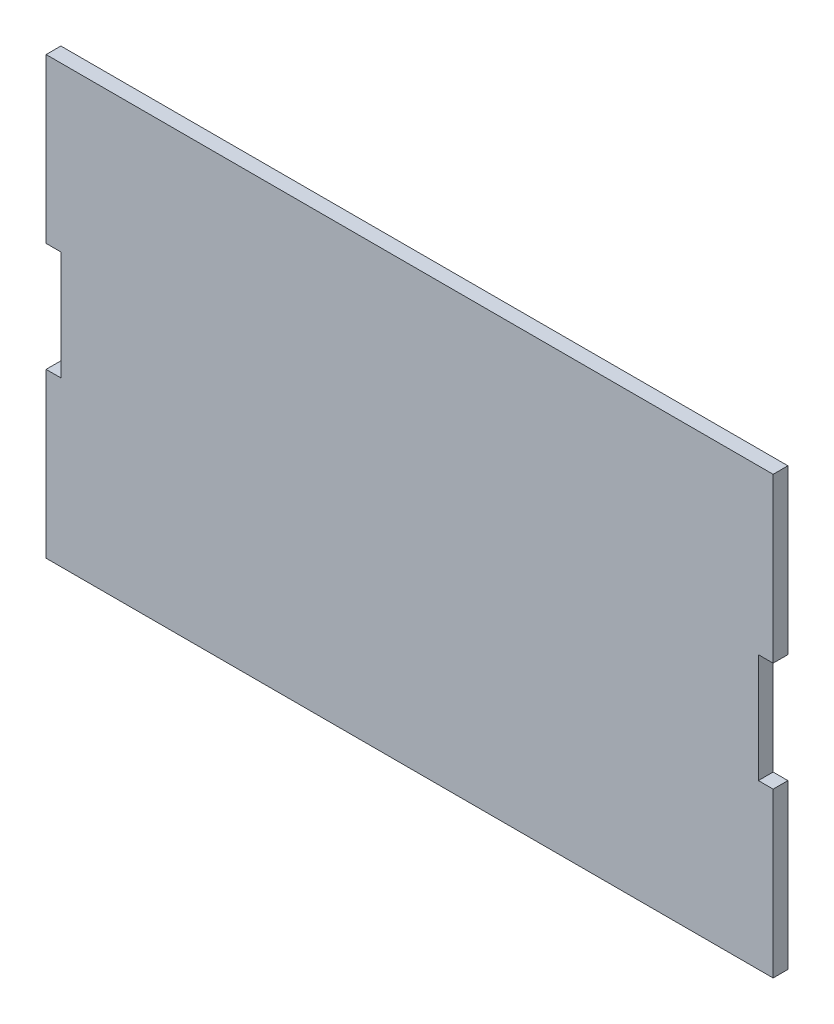
ISO-10303-21;
HEADER;
FILE_DESCRIPTION(('STEP AP214'),'2;1');
FILE_NAME('part.step','',(''),(''),'','','');
FILE_SCHEMA(('AUTOMOTIVE_DESIGN { 1 0 10303 214 1 1 1 1 }'));
ENDSEC;
DATA;
#1=APPLICATION_CONTEXT('core data for automotive mechanical design processes');
#2=APPLICATION_PROTOCOL_DEFINITION('international standard','automotive_design',2000,#1);
#3=PRODUCT_CONTEXT('',#1,'mechanical');
#4=PRODUCT('Part','Part','',(#3));
#5=PRODUCT_RELATED_PRODUCT_CATEGORY('part','',(#4));
#6=PRODUCT_DEFINITION_FORMATION('','',#4);
#7=PRODUCT_DEFINITION_CONTEXT('part definition',#1,'design');
#8=PRODUCT_DEFINITION('design','',#6,#7);
#9=PRODUCT_DEFINITION_SHAPE('','',#8);
#10=(LENGTH_UNIT() NAMED_UNIT(*) SI_UNIT(.MILLI.,.METRE.));
#11=(NAMED_UNIT(*) PLANE_ANGLE_UNIT() SI_UNIT($,.RADIAN.));
#12=(NAMED_UNIT(*) SI_UNIT($,.STERADIAN.) SOLID_ANGLE_UNIT());
#13=UNCERTAINTY_MEASURE_WITH_UNIT(LENGTH_MEASURE(1.E-05),#10,'distance_accuracy_value','');
#14=(GEOMETRIC_REPRESENTATION_CONTEXT(3) GLOBAL_UNCERTAINTY_ASSIGNED_CONTEXT((#13)) GLOBAL_UNIT_ASSIGNED_CONTEXT((#10,
#11,#12)) REPRESENTATION_CONTEXT('',''));
#15=CARTESIAN_POINT('',(0.,0.,0.));
#16=DIRECTION('',(0.,0.,1.));
#17=DIRECTION('',(1.,0.,0.));
#18=AXIS2_PLACEMENT_3D('',#15,#16,#17);
#19=CARTESIAN_POINT('',(250.,37.5,10.16));
#20=DIRECTION('',(-1.,0.,0.));
#21=DIRECTION('',(0.,0.,1.));
#22=AXIS2_PLACEMENT_3D('',#19,#20,#21);
#23=PLANE('',#22);
#24=DIRECTION('',(0.,1.,0.));
#25=VECTOR('',#24,1.);
#26=CARTESIAN_POINT('',(250.,37.5,0.));
#27=LINE('',#26,#25);
#28=CARTESIAN_POINT('',(250.,37.5,0.));
#29=VERTEX_POINT('',#28);
#30=CARTESIAN_POINT('',(250.,150.,0.));
#31=VERTEX_POINT('',#30);
#32=EDGE_CURVE('E157',#29,#31,#27,.T.);
#33=ORIENTED_EDGE('',*,*,#32,.T.);
#34=DIRECTION('',(0.,0.,-1.));
#35=VECTOR('',#34,1.);
#36=CARTESIAN_POINT('',(250.,150.,10.16));
#37=LINE('',#36,#35);
#38=CARTESIAN_POINT('',(250.,150.,10.16));
#39=VERTEX_POINT('',#38);
#40=EDGE_CURVE('E11',#39,#31,#37,.T.);
#41=ORIENTED_EDGE('',*,*,#40,.F.);
#42=DIRECTION('',(0.,1.,0.));
#43=VECTOR('',#42,1.);
#44=CARTESIAN_POINT('',(250.,37.5,10.16));
#45=LINE('',#44,#43);
#46=CARTESIAN_POINT('',(250.,37.5,10.16));
#47=VERTEX_POINT('',#46);
#48=EDGE_CURVE('E179',#47,#39,#45,.T.);
#49=ORIENTED_EDGE('',*,*,#48,.F.);
#50=DIRECTION('',(0.,0.,-1.));
#51=VECTOR('',#50,1.);
#52=CARTESIAN_POINT('',(250.,37.5,10.16));
#53=LINE('',#52,#51);
#54=EDGE_CURVE('E153',#47,#29,#53,.T.);
#55=ORIENTED_EDGE('',*,*,#54,.T.);
#56=EDGE_LOOP('',(#33,#41,#49,#55));
#57=FACE_BOUND('',#56,.T.);
#58=ADVANCED_FACE('F37',(#57),#23,.F.);
#59=CARTESIAN_POINT('',(-250.,150.,10.16));
#60=DIRECTION('',(0.,-1.,0.));
#61=DIRECTION('',(0.,0.,-1.));
#62=AXIS2_PLACEMENT_3D('',#59,#60,#61);
#63=PLANE('',#62);
#64=DIRECTION('',(-1.,0.,0.));
#65=VECTOR('',#64,1.);
#66=CARTESIAN_POINT('',(-250.,150.,0.));
#67=LINE('',#66,#65);
#68=CARTESIAN_POINT('',(-250.,150.,0.));
#69=VERTEX_POINT('',#68);
#70=EDGE_CURVE('E160',#31,#69,#67,.T.);
#71=ORIENTED_EDGE('',*,*,#70,.T.);
#72=DIRECTION('',(0.,0.,-1.));
#73=VECTOR('',#72,1.);
#74=CARTESIAN_POINT('',(-250.,150.,10.16));
#75=LINE('',#74,#73);
#76=CARTESIAN_POINT('',(-250.,150.,10.16));
#77=VERTEX_POINT('',#76);
#78=EDGE_CURVE('E45',#77,#69,#75,.T.);
#79=ORIENTED_EDGE('',*,*,#78,.F.);
#80=DIRECTION('',(-1.,0.,0.));
#81=VECTOR('',#80,1.);
#82=CARTESIAN_POINT('',(-250.,150.,10.16));
#83=LINE('',#82,#81);
#84=EDGE_CURVE('E108',#39,#77,#83,.T.);
#85=ORIENTED_EDGE('',*,*,#84,.F.);
#86=ORIENTED_EDGE('',*,*,#40,.T.);
#87=EDGE_LOOP('',(#71,#79,#85,#86));
#88=FACE_BOUND('',#87,.T.);
#89=ADVANCED_FACE('F257',(#88),#63,.F.);
#90=CARTESIAN_POINT('',(-250.,37.4999999999998,10.16));
#91=DIRECTION('',(1.,0.,0.));
#92=DIRECTION('',(0.,1.,0.));
#93=AXIS2_PLACEMENT_3D('',#90,#91,#92);
#94=PLANE('',#93);
#95=DIRECTION('',(0.,-1.,0.));
#96=VECTOR('',#95,1.);
#97=CARTESIAN_POINT('',(-250.,37.4999999999998,0.));
#98=LINE('',#97,#96);
#99=CARTESIAN_POINT('',(-250.,37.4999999999998,0.));
#100=VERTEX_POINT('',#99);
#101=EDGE_CURVE('E162',#69,#100,#98,.T.);
#102=ORIENTED_EDGE('',*,*,#101,.T.);
#103=DIRECTION('',(0.,0.,-1.));
#104=VECTOR('',#103,1.);
#105=CARTESIAN_POINT('',(-250.,37.4999999999998,10.16));
#106=LINE('',#105,#104);
#107=CARTESIAN_POINT('',(-250.,37.4999999999998,10.16));
#108=VERTEX_POINT('',#107);
#109=EDGE_CURVE('E198',#108,#100,#106,.T.);
#110=ORIENTED_EDGE('',*,*,#109,.F.);
#111=DIRECTION('',(0.,-1.,0.));
#112=VECTOR('',#111,1.);
#113=CARTESIAN_POINT('',(-250.,37.4999999999998,10.16));
#114=LINE('',#113,#112);
#115=EDGE_CURVE('E206',#77,#108,#114,.T.);
#116=ORIENTED_EDGE('',*,*,#115,.F.);
#117=ORIENTED_EDGE('',*,*,#78,.T.);
#118=EDGE_LOOP('',(#102,#110,#116,#117));
#119=FACE_BOUND('',#118,.T.);
#120=ADVANCED_FACE('F204',(#119),#94,.F.);
#121=CARTESIAN_POINT('',(-239.84,37.4999999999998,10.16));
#122=DIRECTION('',(0.,1.,0.));
#123=DIRECTION('',(-1.,0.,0.));
#124=AXIS2_PLACEMENT_3D('',#121,#122,#123);
#125=PLANE('',#124);
#126=DIRECTION('',(1.,0.,0.));
#127=VECTOR('',#126,1.);
#128=CARTESIAN_POINT('',(-239.84,37.4999999999998,0.));
#129=LINE('',#128,#127);
#130=CARTESIAN_POINT('',(-239.84,37.4999999999998,0.));
#131=VERTEX_POINT('',#130);
#132=EDGE_CURVE('E164',#100,#131,#129,.T.);
#133=ORIENTED_EDGE('',*,*,#132,.T.);
#134=DIRECTION('',(0.,0.,-1.));
#135=VECTOR('',#134,1.);
#136=CARTESIAN_POINT('',(-239.84,37.4999999999998,10.16));
#137=LINE('',#136,#135);
#138=CARTESIAN_POINT('',(-239.84,37.4999999999998,10.16));
#139=VERTEX_POINT('',#138);
#140=EDGE_CURVE('E195',#139,#131,#137,.T.);
#141=ORIENTED_EDGE('',*,*,#140,.F.);
#142=DIRECTION('',(1.,0.,0.));
#143=VECTOR('',#142,1.);
#144=CARTESIAN_POINT('',(-239.84,37.4999999999998,10.16));
#145=LINE('',#144,#143);
#146=EDGE_CURVE('E224',#108,#139,#145,.T.);
#147=ORIENTED_EDGE('',*,*,#146,.F.);
#148=ORIENTED_EDGE('',*,*,#109,.T.);
#149=EDGE_LOOP('',(#133,#141,#147,#148));
#150=FACE_BOUND('',#149,.T.);
#151=ADVANCED_FACE('F215',(#150),#125,.F.);
#152=CARTESIAN_POINT('',(-239.84,-37.5000000000002,10.16));
#153=DIRECTION('',(1.,0.,0.));
#154=DIRECTION('',(0.,1.,0.));
#155=AXIS2_PLACEMENT_3D('',#152,#153,#154);
#156=PLANE('',#155);
#157=DIRECTION('',(0.,-1.,0.));
#158=VECTOR('',#157,1.);
#159=CARTESIAN_POINT('',(-239.84,-37.5000000000002,0.));
#160=LINE('',#159,#158);
#161=CARTESIAN_POINT('',(-239.84,-37.5000000000002,0.));
#162=VERTEX_POINT('',#161);
#163=EDGE_CURVE('E166',#131,#162,#160,.T.);
#164=ORIENTED_EDGE('',*,*,#163,.T.);
#165=DIRECTION('',(0.,0.,-1.));
#166=VECTOR('',#165,1.);
#167=CARTESIAN_POINT('',(-239.84,-37.5000000000002,10.16));
#168=LINE('',#167,#166);
#169=CARTESIAN_POINT('',(-239.84,-37.5000000000002,10.16));
#170=VERTEX_POINT('',#169);
#171=EDGE_CURVE('E192',#170,#162,#168,.T.);
#172=ORIENTED_EDGE('',*,*,#171,.F.);
#173=DIRECTION('',(0.,-1.,0.));
#174=VECTOR('',#173,1.);
#175=CARTESIAN_POINT('',(-239.84,-37.5000000000002,10.16));
#176=LINE('',#175,#174);
#177=EDGE_CURVE('E221',#139,#170,#176,.T.);
#178=ORIENTED_EDGE('',*,*,#177,.F.);
#179=ORIENTED_EDGE('',*,*,#140,.T.);
#180=EDGE_LOOP('',(#164,#172,#178,#179));
#181=FACE_BOUND('',#180,.T.);
#182=ADVANCED_FACE('F219',(#181),#156,.F.);
#183=CARTESIAN_POINT('',(-239.84,-37.5000000000002,10.16));
#184=DIRECTION('',(0.,-1.,0.));
#185=DIRECTION('',(0.,0.,-1.));
#186=AXIS2_PLACEMENT_3D('',#183,#184,#185);
#187=PLANE('',#186);
#188=DIRECTION('',(-1.,0.,0.));
#189=VECTOR('',#188,1.);
#190=CARTESIAN_POINT('',(-239.84,-37.5000000000002,0.));
#191=LINE('',#190,#189);
#192=CARTESIAN_POINT('',(-250.,-37.5000000000002,0.));
#193=VERTEX_POINT('',#192);
#194=EDGE_CURVE('E168',#162,#193,#191,.T.);
#195=ORIENTED_EDGE('',*,*,#194,.T.);
#196=DIRECTION('',(0.,0.,-1.));
#197=VECTOR('',#196,1.);
#198=CARTESIAN_POINT('',(-250.,-37.5000000000002,10.16));
#199=LINE('',#198,#197);
#200=CARTESIAN_POINT('',(-250.,-37.5000000000002,10.16));
#201=VERTEX_POINT('',#200);
#202=EDGE_CURVE('E189',#201,#193,#199,.T.);
#203=ORIENTED_EDGE('',*,*,#202,.F.);
#204=DIRECTION('',(-1.,0.,0.));
#205=VECTOR('',#204,1.);
#206=CARTESIAN_POINT('',(-239.84,-37.5000000000002,10.16));
#207=LINE('',#206,#205);
#208=EDGE_CURVE('E223',#170,#201,#207,.T.);
#209=ORIENTED_EDGE('',*,*,#208,.F.);
#210=ORIENTED_EDGE('',*,*,#171,.T.);
#211=EDGE_LOOP('',(#195,#203,#209,#210));
#212=FACE_BOUND('',#211,.T.);
#213=ADVANCED_FACE('F270',(#212),#187,.F.);
#214=CARTESIAN_POINT('',(-250.,-150.,10.16));
#215=DIRECTION('',(1.,0.,0.));
#216=DIRECTION('',(0.,1.,0.));
#217=AXIS2_PLACEMENT_3D('',#214,#215,#216);
#218=PLANE('',#217);
#219=DIRECTION('',(0.,-1.,0.));
#220=VECTOR('',#219,1.);
#221=CARTESIAN_POINT('',(-250.,-150.,0.));
#222=LINE('',#221,#220);
#223=CARTESIAN_POINT('',(-250.,-150.,0.));
#224=VERTEX_POINT('',#223);
#225=EDGE_CURVE('E170',#193,#224,#222,.T.);
#226=ORIENTED_EDGE('',*,*,#225,.T.);
#227=DIRECTION('',(0.,0.,-1.));
#228=VECTOR('',#227,1.);
#229=CARTESIAN_POINT('',(-250.,-150.,10.16));
#230=LINE('',#229,#228);
#231=CARTESIAN_POINT('',(-250.,-150.,10.16));
#232=VERTEX_POINT('',#231);
#233=EDGE_CURVE('E186',#232,#224,#230,.T.);
#234=ORIENTED_EDGE('',*,*,#233,.F.);
#235=DIRECTION('',(0.,-1.,0.));
#236=VECTOR('',#235,1.);
#237=CARTESIAN_POINT('',(-250.,-150.,10.16));
#238=LINE('',#237,#236);
#239=EDGE_CURVE('E226',#201,#232,#238,.T.);
#240=ORIENTED_EDGE('',*,*,#239,.F.);
#241=ORIENTED_EDGE('',*,*,#202,.T.);
#242=EDGE_LOOP('',(#226,#234,#240,#241));
#243=FACE_BOUND('',#242,.T.);
#244=ADVANCED_FACE('F273',(#243),#218,.F.);
#245=CARTESIAN_POINT('',(-250.,-150.,10.16));
#246=DIRECTION('',(0.,1.,0.));
#247=DIRECTION('',(0.,0.,1.));
#248=AXIS2_PLACEMENT_3D('',#245,#246,#247);
#249=PLANE('',#248);
#250=DIRECTION('',(1.,0.,0.));
#251=VECTOR('',#250,1.);
#252=CARTESIAN_POINT('',(-250.,-150.,0.));
#253=LINE('',#252,#251);
#254=CARTESIAN_POINT('',(250.,-150.,0.));
#255=VERTEX_POINT('',#254);
#256=EDGE_CURVE('E172',#224,#255,#253,.T.);
#257=ORIENTED_EDGE('',*,*,#256,.T.);
#258=DIRECTION('',(0.,0.,-1.));
#259=VECTOR('',#258,1.);
#260=CARTESIAN_POINT('',(250.,-150.,10.16));
#261=LINE('',#260,#259);
#262=CARTESIAN_POINT('',(250.,-150.,10.16));
#263=VERTEX_POINT('',#262);
#264=EDGE_CURVE('E183',#263,#255,#261,.T.);
#265=ORIENTED_EDGE('',*,*,#264,.F.);
#266=DIRECTION('',(1.,0.,0.));
#267=VECTOR('',#266,1.);
#268=CARTESIAN_POINT('',(-250.,-150.,10.16));
#269=LINE('',#268,#267);
#270=EDGE_CURVE('E232',#232,#263,#269,.T.);
#271=ORIENTED_EDGE('',*,*,#270,.F.);
#272=ORIENTED_EDGE('',*,*,#233,.T.);
#273=EDGE_LOOP('',(#257,#265,#271,#272));
#274=FACE_BOUND('',#273,.T.);
#275=ADVANCED_FACE('F238',(#274),#249,.F.);
#276=CARTESIAN_POINT('',(250.,-150.,10.16));
#277=DIRECTION('',(-1.,0.,0.));
#278=DIRECTION('',(0.,0.,1.));
#279=AXIS2_PLACEMENT_3D('',#276,#277,#278);
#280=PLANE('',#279);
#281=DIRECTION('',(0.,1.,0.));
#282=VECTOR('',#281,1.);
#283=CARTESIAN_POINT('',(250.,-150.,0.));
#284=LINE('',#283,#282);
#285=CARTESIAN_POINT('',(250.,-37.5,0.));
#286=VERTEX_POINT('',#285);
#287=EDGE_CURVE('E174',#255,#286,#284,.T.);
#288=ORIENTED_EDGE('',*,*,#287,.T.);
#289=DIRECTION('',(0.,0.,-1.));
#290=VECTOR('',#289,1.);
#291=CARTESIAN_POINT('',(250.,-37.5,10.16));
#292=LINE('',#291,#290);
#293=CARTESIAN_POINT('',(250.,-37.5,10.16));
#294=VERTEX_POINT('',#293);
#295=EDGE_CURVE('E148',#294,#286,#292,.T.);
#296=ORIENTED_EDGE('',*,*,#295,.F.);
#297=DIRECTION('',(0.,1.,0.));
#298=VECTOR('',#297,1.);
#299=CARTESIAN_POINT('',(250.,-150.,10.16));
#300=LINE('',#299,#298);
#301=EDGE_CURVE('E139',#263,#294,#300,.T.);
#302=ORIENTED_EDGE('',*,*,#301,.F.);
#303=ORIENTED_EDGE('',*,*,#264,.T.);
#304=EDGE_LOOP('',(#288,#296,#302,#303));
#305=FACE_BOUND('',#304,.T.);
#306=ADVANCED_FACE('F242',(#305),#280,.F.);
#307=CARTESIAN_POINT('',(239.84,-37.5,10.16));
#308=DIRECTION('',(0.,-1.,0.));
#309=DIRECTION('',(0.,0.,-1.));
#310=AXIS2_PLACEMENT_3D('',#307,#308,#309);
#311=PLANE('',#310);
#312=DIRECTION('',(-1.,0.,0.));
#313=VECTOR('',#312,1.);
#314=CARTESIAN_POINT('',(239.84,-37.5,0.));
#315=LINE('',#314,#313);
#316=CARTESIAN_POINT('',(239.84,-37.5,0.));
#317=VERTEX_POINT('',#316);
#318=EDGE_CURVE('E147',#286,#317,#315,.T.);
#319=ORIENTED_EDGE('',*,*,#318,.T.);
#320=DIRECTION('',(0.,0.,-1.));
#321=VECTOR('',#320,1.);
#322=CARTESIAN_POINT('',(239.84,-37.5,10.16));
#323=LINE('',#322,#321);
#324=CARTESIAN_POINT('',(239.84,-37.5,10.16));
#325=VERTEX_POINT('',#324);
#326=EDGE_CURVE('E144',#325,#317,#323,.T.);
#327=ORIENTED_EDGE('',*,*,#326,.F.);
#328=DIRECTION('',(-1.,0.,0.));
#329=VECTOR('',#328,1.);
#330=CARTESIAN_POINT('',(239.84,-37.5,10.16));
#331=LINE('',#330,#329);
#332=EDGE_CURVE('E133',#294,#325,#331,.T.);
#333=ORIENTED_EDGE('',*,*,#332,.F.);
#334=ORIENTED_EDGE('',*,*,#295,.T.);
#335=EDGE_LOOP('',(#319,#327,#333,#334));
#336=FACE_BOUND('',#335,.T.);
#337=ADVANCED_FACE('F145',(#336),#311,.F.);
#338=CARTESIAN_POINT('',(239.84,-37.5,10.16));
#339=DIRECTION('',(-1.,0.,0.));
#340=DIRECTION('',(0.,0.,1.));
#341=AXIS2_PLACEMENT_3D('',#338,#339,#340);
#342=PLANE('',#341);
#343=DIRECTION('',(0.,1.,0.));
#344=VECTOR('',#343,1.);
#345=CARTESIAN_POINT('',(239.84,-37.5,0.));
#346=LINE('',#345,#344);
#347=CARTESIAN_POINT('',(239.84,37.5,0.));
#348=VERTEX_POINT('',#347);
#349=EDGE_CURVE('E94',#317,#348,#346,.T.);
#350=ORIENTED_EDGE('',*,*,#349,.T.);
#351=DIRECTION('',(0.,0.,-1.));
#352=VECTOR('',#351,1.);
#353=CARTESIAN_POINT('',(239.84,37.5,10.16));
#354=LINE('',#353,#352);
#355=CARTESIAN_POINT('',(239.84,37.5,10.16));
#356=VERTEX_POINT('',#355);
#357=EDGE_CURVE('E149',#356,#348,#354,.T.);
#358=ORIENTED_EDGE('',*,*,#357,.F.);
#359=DIRECTION('',(0.,1.,0.));
#360=VECTOR('',#359,1.);
#361=CARTESIAN_POINT('',(239.84,-37.5,10.16));
#362=LINE('',#361,#360);
#363=EDGE_CURVE('E137',#325,#356,#362,.T.);
#364=ORIENTED_EDGE('',*,*,#363,.F.);
#365=ORIENTED_EDGE('',*,*,#326,.T.);
#366=EDGE_LOOP('',(#350,#358,#364,#365));
#367=FACE_BOUND('',#366,.T.);
#368=ADVANCED_FACE('F151',(#367),#342,.F.);
#369=CARTESIAN_POINT('',(239.84,37.5,10.16));
#370=DIRECTION('',(0.,1.,0.));
#371=DIRECTION('',(-1.,0.,0.));
#372=AXIS2_PLACEMENT_3D('',#369,#370,#371);
#373=PLANE('',#372);
#374=DIRECTION('',(1.,0.,0.));
#375=VECTOR('',#374,1.);
#376=CARTESIAN_POINT('',(239.84,37.5,0.));
#377=LINE('',#376,#375);
#378=EDGE_CURVE('E100',#348,#29,#377,.T.);
#379=ORIENTED_EDGE('',*,*,#378,.T.);
#380=ORIENTED_EDGE('',*,*,#54,.F.);
#381=DIRECTION('',(1.,0.,0.));
#382=VECTOR('',#381,1.);
#383=CARTESIAN_POINT('',(239.84,37.5,10.16));
#384=LINE('',#383,#382);
#385=EDGE_CURVE('E53',#356,#47,#384,.T.);
#386=ORIENTED_EDGE('',*,*,#385,.F.);
#387=ORIENTED_EDGE('',*,*,#357,.T.);
#388=EDGE_LOOP('',(#379,#380,#386,#387));
#389=FACE_BOUND('',#388,.T.);
#390=ADVANCED_FACE('F246',(#389),#373,.F.);
#391=CARTESIAN_POINT('',(0.,0.,10.16));
#392=DIRECTION('',(0.,0.,-1.));
#393=DIRECTION('',(-1.,0.,0.));
#394=AXIS2_PLACEMENT_3D('',#391,#392,#393);
#395=PLANE('',#394);
#396=ORIENTED_EDGE('',*,*,#48,.T.);
#397=ORIENTED_EDGE('',*,*,#84,.T.);
#398=ORIENTED_EDGE('',*,*,#115,.T.);
#399=ORIENTED_EDGE('',*,*,#146,.T.);
#400=ORIENTED_EDGE('',*,*,#177,.T.);
#401=ORIENTED_EDGE('',*,*,#208,.T.);
#402=ORIENTED_EDGE('',*,*,#239,.T.);
#403=ORIENTED_EDGE('',*,*,#270,.T.);
#404=ORIENTED_EDGE('',*,*,#301,.T.);
#405=ORIENTED_EDGE('',*,*,#332,.T.);
#406=ORIENTED_EDGE('',*,*,#363,.T.);
#407=ORIENTED_EDGE('',*,*,#385,.T.);
#408=EDGE_LOOP('',(#396,#397,#398,#399,#400,#401,#402,#403,#404,#405,#406,#407));
#409=FACE_BOUND('',#408,.T.);
#410=ADVANCED_FACE('F135',(#409),#395,.F.);
#411=CARTESIAN_POINT('',(0.,0.,0.));
#412=DIRECTION('',(0.,0.,-1.));
#413=DIRECTION('',(-1.,0.,0.));
#414=AXIS2_PLACEMENT_3D('',#411,#412,#413);
#415=PLANE('',#414);
#416=ORIENTED_EDGE('',*,*,#32,.F.);
#417=ORIENTED_EDGE('',*,*,#378,.F.);
#418=ORIENTED_EDGE('',*,*,#349,.F.);
#419=ORIENTED_EDGE('',*,*,#318,.F.);
#420=ORIENTED_EDGE('',*,*,#287,.F.);
#421=ORIENTED_EDGE('',*,*,#256,.F.);
#422=ORIENTED_EDGE('',*,*,#225,.F.);
#423=ORIENTED_EDGE('',*,*,#194,.F.);
#424=ORIENTED_EDGE('',*,*,#163,.F.);
#425=ORIENTED_EDGE('',*,*,#132,.F.);
#426=ORIENTED_EDGE('',*,*,#101,.F.);
#427=ORIENTED_EDGE('',*,*,#70,.F.);
#428=EDGE_LOOP('',(#416,#417,#418,#419,#420,#421,#422,#423,#424,#425,#426,#427));
#429=FACE_BOUND('',#428,.T.);
#430=ADVANCED_FACE('F210',(#429),#415,.T.);
#431=CLOSED_SHELL('',(#58,#89,#120,#151,#182,#213,#244,#275,#306,#337,#368,#390,#410,#430));
#432=MANIFOLD_SOLID_BREP('B2',#431);
#433=ADVANCED_BREP_SHAPE_REPRESENTATION('',(#18,#432),#14);
#434=SHAPE_DEFINITION_REPRESENTATION(#9,#433);
ENDSEC;
END-ISO-10303-21;
